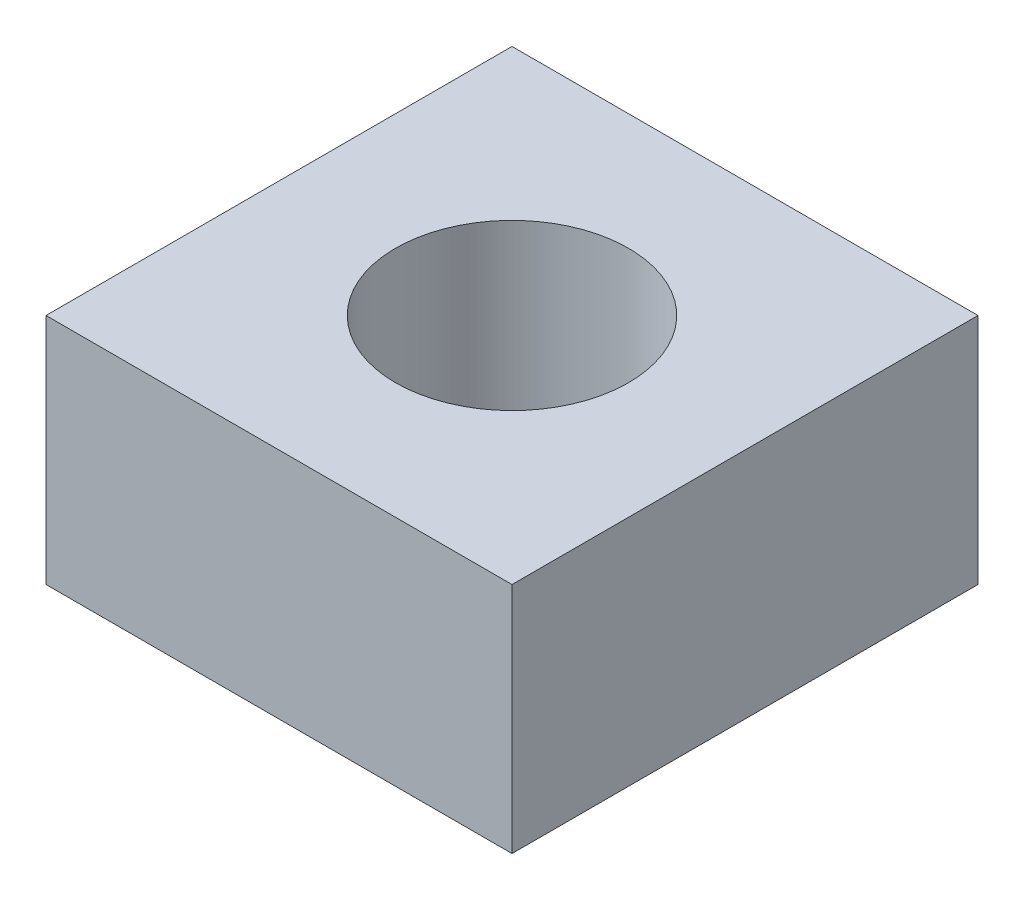
ISO-10303-21;
HEADER;
FILE_DESCRIPTION(('STEP AP214'),'2;1');
FILE_NAME('part.step','',(''),(''),'','','');
FILE_SCHEMA(('AUTOMOTIVE_DESIGN { 1 0 10303 214 1 1 1 1 }'));
ENDSEC;
DATA;
#1=APPLICATION_CONTEXT('core data for automotive mechanical design processes');
#2=APPLICATION_PROTOCOL_DEFINITION('international standard','automotive_design',2000,#1);
#3=PRODUCT_CONTEXT('',#1,'mechanical');
#4=PRODUCT('Part','Part','',(#3));
#5=PRODUCT_RELATED_PRODUCT_CATEGORY('part','',(#4));
#6=PRODUCT_DEFINITION_FORMATION('','',#4);
#7=PRODUCT_DEFINITION_CONTEXT('part definition',#1,'design');
#8=PRODUCT_DEFINITION('design','',#6,#7);
#9=PRODUCT_DEFINITION_SHAPE('','',#8);
#10=(LENGTH_UNIT() NAMED_UNIT(*) SI_UNIT(.MILLI.,.METRE.));
#11=(NAMED_UNIT(*) PLANE_ANGLE_UNIT() SI_UNIT($,.RADIAN.));
#12=(NAMED_UNIT(*) SI_UNIT($,.STERADIAN.) SOLID_ANGLE_UNIT());
#13=UNCERTAINTY_MEASURE_WITH_UNIT(LENGTH_MEASURE(1.E-05),#10,'distance_accuracy_value','');
#14=(GEOMETRIC_REPRESENTATION_CONTEXT(3) GLOBAL_UNCERTAINTY_ASSIGNED_CONTEXT((#13)) GLOBAL_UNIT_ASSIGNED_CONTEXT((#10,
#11,#12)) REPRESENTATION_CONTEXT('',''));
#15=CARTESIAN_POINT('',(0.,0.,0.));
#16=DIRECTION('',(0.,0.,1.));
#17=DIRECTION('',(1.,0.,0.));
#18=AXIS2_PLACEMENT_3D('',#15,#16,#17);
#19=CARTESIAN_POINT('',(0.,10.,0.));
#20=DIRECTION('',(0.,1.,0.));
#21=DIRECTION('',(0.,0.,1.));
#22=AXIS2_PLACEMENT_3D('',#19,#20,#21);
#23=PLANE('',#22);
#24=DIRECTION('',(0.,0.,-1.));
#25=VECTOR('',#24,1.);
#26=CARTESIAN_POINT('',(10.,10.,-10.));
#27=LINE('',#26,#25);
#28=CARTESIAN_POINT('',(10.,10.,10.));
#29=VERTEX_POINT('',#28);
#30=CARTESIAN_POINT('',(10.,10.,-10.));
#31=VERTEX_POINT('',#30);
#32=EDGE_CURVE('E92',#29,#31,#27,.T.);
#33=ORIENTED_EDGE('',*,*,#32,.T.);
#34=DIRECTION('',(-1.,0.,0.));
#35=VECTOR('',#34,1.);
#36=CARTESIAN_POINT('',(-10.,10.,-10.));
#37=LINE('',#36,#35);
#38=CARTESIAN_POINT('',(-10.,10.,-10.));
#39=VERTEX_POINT('',#38);
#40=EDGE_CURVE('E87',#31,#39,#37,.T.);
#41=ORIENTED_EDGE('',*,*,#40,.T.);
#42=DIRECTION('',(0.,0.,1.));
#43=VECTOR('',#42,1.);
#44=CARTESIAN_POINT('',(-10.,10.,-10.));
#45=LINE('',#44,#43);
#46=CARTESIAN_POINT('',(-10.,10.,10.));
#47=VERTEX_POINT('',#46);
#48=EDGE_CURVE('E90',#39,#47,#45,.T.);
#49=ORIENTED_EDGE('',*,*,#48,.T.);
#50=DIRECTION('',(1.,0.,0.));
#51=VECTOR('',#50,1.);
#52=CARTESIAN_POINT('',(-10.,10.,10.));
#53=LINE('',#52,#51);
#54=EDGE_CURVE('E57',#47,#29,#53,.T.);
#55=ORIENTED_EDGE('',*,*,#54,.T.);
#56=EDGE_LOOP('',(#33,#41,#49,#55));
#57=FACE_BOUND('',#56,.T.);
#58=CARTESIAN_POINT('',(0.,10.,0.));
#59=DIRECTION('',(0.,1.,0.));
#60=DIRECTION('',(0.,0.,1.));
#61=AXIS2_PLACEMENT_3D('',#58,#59,#60);
#62=CIRCLE('',#61,5.);
#63=CARTESIAN_POINT('',(0.,10.,5.));
#64=VERTEX_POINT('',#63);
#65=EDGE_CURVE('E112',#64,#64,#62,.T.);
#66=ORIENTED_EDGE('',*,*,#65,.F.);
#67=EDGE_LOOP('',(#66));
#68=FACE_BOUND('',#67,.T.);
#69=ADVANCED_FACE('F39',(#57,#68),#23,.T.);
#70=CARTESIAN_POINT('',(0.,0.,0.));
#71=DIRECTION('',(0.,1.,0.));
#72=DIRECTION('',(0.,0.,1.));
#73=AXIS2_PLACEMENT_3D('',#70,#71,#72);
#74=PLANE('',#73);
#75=DIRECTION('',(0.,0.,-1.));
#76=VECTOR('',#75,1.);
#77=CARTESIAN_POINT('',(10.,0.,-10.));
#78=LINE('',#77,#76);
#79=CARTESIAN_POINT('',(10.,0.,10.));
#80=VERTEX_POINT('',#79);
#81=CARTESIAN_POINT('',(10.,0.,-10.));
#82=VERTEX_POINT('',#81);
#83=EDGE_CURVE('E108',#80,#82,#78,.T.);
#84=ORIENTED_EDGE('',*,*,#83,.F.);
#85=DIRECTION('',(1.,0.,0.));
#86=VECTOR('',#85,1.);
#87=CARTESIAN_POINT('',(-10.,0.,10.));
#88=LINE('',#87,#86);
#89=CARTESIAN_POINT('',(-10.,0.,10.));
#90=VERTEX_POINT('',#89);
#91=EDGE_CURVE('E80',#90,#80,#88,.T.);
#92=ORIENTED_EDGE('',*,*,#91,.F.);
#93=DIRECTION('',(0.,0.,1.));
#94=VECTOR('',#93,1.);
#95=CARTESIAN_POINT('',(-10.,0.,-10.));
#96=LINE('',#95,#94);
#97=CARTESIAN_POINT('',(-10.,0.,-10.));
#98=VERTEX_POINT('',#97);
#99=EDGE_CURVE('E74',#98,#90,#96,.T.);
#100=ORIENTED_EDGE('',*,*,#99,.F.);
#101=DIRECTION('',(-1.,0.,0.));
#102=VECTOR('',#101,1.);
#103=CARTESIAN_POINT('',(-10.,0.,-10.));
#104=LINE('',#103,#102);
#105=EDGE_CURVE('E97',#82,#98,#104,.T.);
#106=ORIENTED_EDGE('',*,*,#105,.F.);
#107=EDGE_LOOP('',(#84,#92,#100,#106));
#108=FACE_BOUND('',#107,.T.);
#109=CARTESIAN_POINT('',(0.,0.,0.));
#110=DIRECTION('',(0.,1.,0.));
#111=DIRECTION('',(0.,0.,1.));
#112=AXIS2_PLACEMENT_3D('',#109,#110,#111);
#113=CIRCLE('',#112,5.);
#114=CARTESIAN_POINT('',(0.,0.,5.));
#115=VERTEX_POINT('',#114);
#116=EDGE_CURVE('E130',#115,#115,#113,.T.);
#117=ORIENTED_EDGE('',*,*,#116,.T.);
#118=EDGE_LOOP('',(#117));
#119=FACE_BOUND('',#118,.T.);
#120=ADVANCED_FACE('F125',(#108,#119),#74,.F.);
#121=CARTESIAN_POINT('',(10.,10.,-10.));
#122=DIRECTION('',(-1.,0.,0.));
#123=DIRECTION('',(0.,0.,1.));
#124=AXIS2_PLACEMENT_3D('',#121,#122,#123);
#125=PLANE('',#124);
#126=ORIENTED_EDGE('',*,*,#83,.T.);
#127=DIRECTION('',(0.,-1.,0.));
#128=VECTOR('',#127,1.);
#129=CARTESIAN_POINT('',(10.,10.,-10.));
#130=LINE('',#129,#128);
#131=EDGE_CURVE('E11',#31,#82,#130,.T.);
#132=ORIENTED_EDGE('',*,*,#131,.F.);
#133=ORIENTED_EDGE('',*,*,#32,.F.);
#134=DIRECTION('',(0.,-1.,0.));
#135=VECTOR('',#134,1.);
#136=CARTESIAN_POINT('',(10.,10.,10.));
#137=LINE('',#136,#135);
#138=EDGE_CURVE('E104',#29,#80,#137,.T.);
#139=ORIENTED_EDGE('',*,*,#138,.T.);
#140=EDGE_LOOP('',(#126,#132,#133,#139));
#141=FACE_BOUND('',#140,.T.);
#142=ADVANCED_FACE('F41',(#141),#125,.F.);
#143=CARTESIAN_POINT('',(-10.,10.,-10.));
#144=DIRECTION('',(0.,0.,1.));
#145=DIRECTION('',(1.,0.,0.));
#146=AXIS2_PLACEMENT_3D('',#143,#144,#145);
#147=PLANE('',#146);
#148=ORIENTED_EDGE('',*,*,#105,.T.);
#149=DIRECTION('',(0.,-1.,0.));
#150=VECTOR('',#149,1.);
#151=CARTESIAN_POINT('',(-10.,10.,-10.));
#152=LINE('',#151,#150);
#153=EDGE_CURVE('E49',#39,#98,#152,.T.);
#154=ORIENTED_EDGE('',*,*,#153,.F.);
#155=ORIENTED_EDGE('',*,*,#40,.F.);
#156=ORIENTED_EDGE('',*,*,#131,.T.);
#157=EDGE_LOOP('',(#148,#154,#155,#156));
#158=FACE_BOUND('',#157,.T.);
#159=ADVANCED_FACE('F96',(#158),#147,.F.);
#160=CARTESIAN_POINT('',(-10.,10.,-10.));
#161=DIRECTION('',(1.,0.,0.));
#162=DIRECTION('',(0.,0.,-1.));
#163=AXIS2_PLACEMENT_3D('',#160,#161,#162);
#164=PLANE('',#163);
#165=ORIENTED_EDGE('',*,*,#99,.T.);
#166=DIRECTION('',(0.,-1.,0.));
#167=VECTOR('',#166,1.);
#168=CARTESIAN_POINT('',(-10.,10.,10.));
#169=LINE('',#168,#167);
#170=EDGE_CURVE('E99',#47,#90,#169,.T.);
#171=ORIENTED_EDGE('',*,*,#170,.F.);
#172=ORIENTED_EDGE('',*,*,#48,.F.);
#173=ORIENTED_EDGE('',*,*,#153,.T.);
#174=EDGE_LOOP('',(#165,#171,#172,#173));
#175=FACE_BOUND('',#174,.T.);
#176=ADVANCED_FACE('F100',(#175),#164,.F.);
#177=CARTESIAN_POINT('',(-10.,10.,10.));
#178=DIRECTION('',(0.,0.,-1.));
#179=DIRECTION('',(-1.,0.,0.));
#180=AXIS2_PLACEMENT_3D('',#177,#178,#179);
#181=PLANE('',#180);
#182=ORIENTED_EDGE('',*,*,#91,.T.);
#183=ORIENTED_EDGE('',*,*,#138,.F.);
#184=ORIENTED_EDGE('',*,*,#54,.F.);
#185=ORIENTED_EDGE('',*,*,#170,.T.);
#186=EDGE_LOOP('',(#182,#183,#184,#185));
#187=FACE_BOUND('',#186,.T.);
#188=ADVANCED_FACE('F122',(#187),#181,.F.);
#189=CARTESIAN_POINT('',(0.,10.,0.));
#190=DIRECTION('',(0.,-1.,0.));
#191=DIRECTION('',(0.,0.,-1.));
#192=AXIS2_PLACEMENT_3D('',#189,#190,#191);
#193=CYLINDRICAL_SURFACE('',#192,5.);
#194=ORIENTED_EDGE('',*,*,#65,.T.);
#195=EDGE_LOOP('',(#194));
#196=FACE_BOUND('',#195,.T.);
#197=ORIENTED_EDGE('',*,*,#116,.F.);
#198=EDGE_LOOP('',(#197));
#199=FACE_BOUND('',#198,.T.);
#200=ADVANCED_FACE('F138',(#196,#199),#193,.F.);
#201=CLOSED_SHELL('',(#69,#120,#142,#159,#176,#188,#200));
#202=MANIFOLD_SOLID_BREP('B2',#201);
#203=ADVANCED_BREP_SHAPE_REPRESENTATION('',(#18,#202),#14);
#204=SHAPE_DEFINITION_REPRESENTATION(#9,#203);
ENDSEC;
END-ISO-10303-21;
